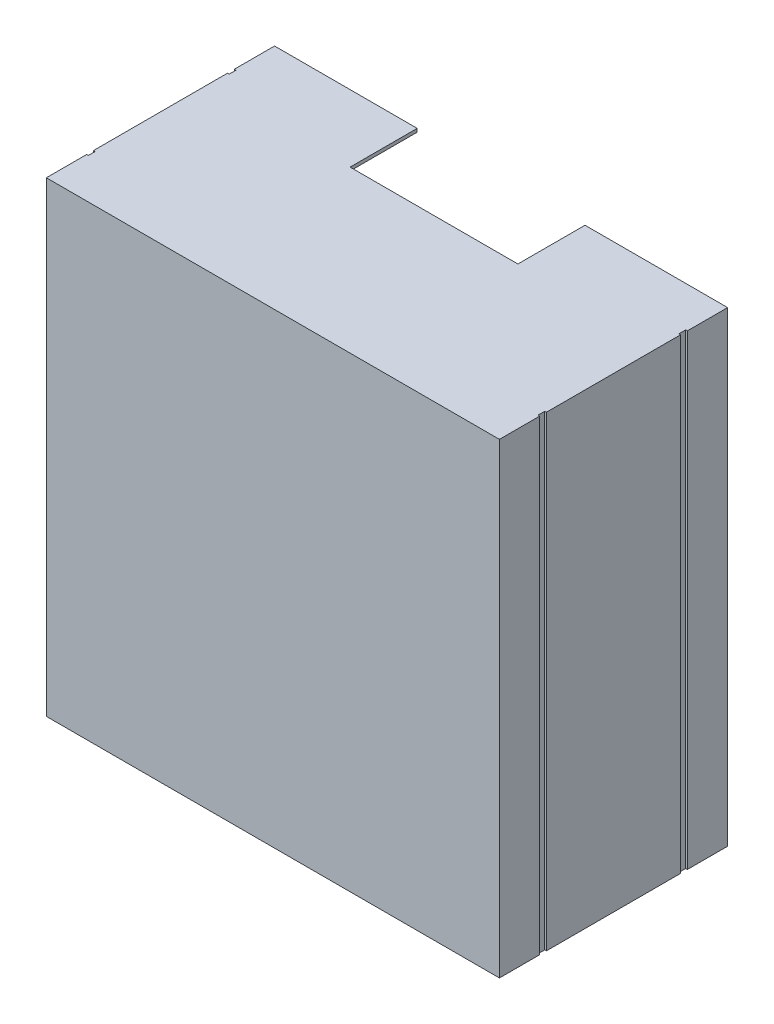
ISO-10303-21;
HEADER;
FILE_DESCRIPTION(('STEP AP214'),'2;1');
FILE_NAME('part.step','',(''),(''),'','','');
FILE_SCHEMA(('AUTOMOTIVE_DESIGN { 1 0 10303 214 1 1 1 1 }'));
ENDSEC;
DATA;
#1=APPLICATION_CONTEXT('core data for automotive mechanical design processes');
#2=APPLICATION_PROTOCOL_DEFINITION('international standard','automotive_design',2000,#1);
#3=PRODUCT_CONTEXT('',#1,'mechanical');
#4=PRODUCT('Part','Part','',(#3));
#5=PRODUCT_RELATED_PRODUCT_CATEGORY('part','',(#4));
#6=PRODUCT_DEFINITION_FORMATION('','',#4);
#7=PRODUCT_DEFINITION_CONTEXT('part definition',#1,'design');
#8=PRODUCT_DEFINITION('design','',#6,#7);
#9=PRODUCT_DEFINITION_SHAPE('','',#8);
#10=(LENGTH_UNIT() NAMED_UNIT(*) SI_UNIT(.MILLI.,.METRE.));
#11=(NAMED_UNIT(*) PLANE_ANGLE_UNIT() SI_UNIT($,.RADIAN.));
#12=(NAMED_UNIT(*) SI_UNIT($,.STERADIAN.) SOLID_ANGLE_UNIT());
#13=UNCERTAINTY_MEASURE_WITH_UNIT(LENGTH_MEASURE(1.E-05),#10,'distance_accuracy_value','');
#14=(GEOMETRIC_REPRESENTATION_CONTEXT(3) GLOBAL_UNCERTAINTY_ASSIGNED_CONTEXT((#13)) GLOBAL_UNIT_ASSIGNED_CONTEXT((#10,
#11,#12)) REPRESENTATION_CONTEXT('',''));
#15=CARTESIAN_POINT('',(0.,0.,0.));
#16=DIRECTION('',(0.,0.,1.));
#17=DIRECTION('',(1.,0.,0.));
#18=AXIS2_PLACEMENT_3D('',#15,#16,#17);
#19=CARTESIAN_POINT('',(-135.,278.,68.));
#20=DIRECTION('',(1.,0.,0.));
#21=DIRECTION('',(0.,0.,-1.));
#22=AXIS2_PLACEMENT_3D('',#19,#20,#21);
#23=PLANE('',#22);
#24=DIRECTION('',(0.,0.,1.));
#25=VECTOR('',#24,1.);
#26=CARTESIAN_POINT('',(-135.,0.,68.));
#27=LINE('',#26,#25);
#28=CARTESIAN_POINT('',(-135.,0.,-68.));
#29=VERTEX_POINT('',#28);
#30=CARTESIAN_POINT('',(-135.,0.,-43.9999999999999));
#31=VERTEX_POINT('',#30);
#32=EDGE_CURVE('E292',#29,#31,#27,.T.);
#33=ORIENTED_EDGE('',*,*,#32,.T.);
#34=DIRECTION('',(0.,-1.,0.));
#35=VECTOR('',#34,1.);
#36=CARTESIAN_POINT('',(-135.,278.001,-43.9999999999999));
#37=LINE('',#36,#35);
#38=CARTESIAN_POINT('',(-135.,278.,-43.9999999999999));
#39=VERTEX_POINT('',#38);
#40=EDGE_CURVE('E248',#39,#31,#37,.T.);
#41=ORIENTED_EDGE('',*,*,#40,.F.);
#42=DIRECTION('',(0.,0.,1.));
#43=VECTOR('',#42,1.);
#44=CARTESIAN_POINT('',(-135.,278.,68.));
#45=LINE('',#44,#43);
#46=CARTESIAN_POINT('',(-135.,278.,-68.));
#47=VERTEX_POINT('',#46);
#48=EDGE_CURVE('E266',#47,#39,#45,.T.);
#49=ORIENTED_EDGE('',*,*,#48,.F.);
#50=DIRECTION('',(0.,-1.,0.));
#51=VECTOR('',#50,1.);
#52=CARTESIAN_POINT('',(-135.,278.,-68.));
#53=LINE('',#52,#51);
#54=EDGE_CURVE('E291',#47,#29,#53,.T.);
#55=ORIENTED_EDGE('',*,*,#54,.T.);
#56=EDGE_LOOP('',(#33,#41,#49,#55));
#57=FACE_BOUND('',#56,.T.);
#58=ADVANCED_FACE('F47',(#57),#23,.F.);
#59=CARTESIAN_POINT('',(-135.,278.,44.));
#60=VERTEX_POINT('',#59);
#61=CARTESIAN_POINT('',(-135.,278.,68.));
#62=VERTEX_POINT('',#61);
#63=EDGE_CURVE('E267',#60,#62,#45,.T.);
#64=ORIENTED_EDGE('',*,*,#63,.F.);
#65=DIRECTION('',(0.,-1.,0.));
#66=VECTOR('',#65,1.);
#67=CARTESIAN_POINT('',(-135.,278.001,44.));
#68=LINE('',#67,#66);
#69=CARTESIAN_POINT('',(-135.,0.,44.));
#70=VERTEX_POINT('',#69);
#71=EDGE_CURVE('E380',#60,#70,#68,.T.);
#72=ORIENTED_EDGE('',*,*,#71,.T.);
#73=CARTESIAN_POINT('',(-135.,0.,68.));
#74=VERTEX_POINT('',#73);
#75=EDGE_CURVE('E298',#70,#74,#27,.T.);
#76=ORIENTED_EDGE('',*,*,#75,.T.);
#77=DIRECTION('',(0.,-1.,0.));
#78=VECTOR('',#77,1.);
#79=CARTESIAN_POINT('',(-135.,278.,68.));
#80=LINE('',#79,#78);
#81=EDGE_CURVE('E12',#62,#74,#80,.T.);
#82=ORIENTED_EDGE('',*,*,#81,.F.);
#83=EDGE_LOOP('',(#64,#72,#76,#82));
#84=FACE_BOUND('',#83,.T.);
#85=ADVANCED_FACE('F504',(#84),#23,.F.);
#86=CARTESIAN_POINT('',(135.,278.,68.));
#87=DIRECTION('',(-1.,0.,0.));
#88=DIRECTION('',(0.,0.,1.));
#89=AXIS2_PLACEMENT_3D('',#86,#87,#88);
#90=PLANE('',#89);
#91=DIRECTION('',(0.,0.,-1.));
#92=VECTOR('',#91,1.);
#93=CARTESIAN_POINT('',(135.,0.,68.));
#94=LINE('',#93,#92);
#95=CARTESIAN_POINT('',(135.,0.,68.));
#96=VERTEX_POINT('',#95);
#97=CARTESIAN_POINT('',(135.,0.,44.));
#98=VERTEX_POINT('',#97);
#99=EDGE_CURVE('E302',#96,#98,#94,.T.);
#100=ORIENTED_EDGE('',*,*,#99,.T.);
#101=DIRECTION('',(0.,-1.,0.));
#102=VECTOR('',#101,1.);
#103=CARTESIAN_POINT('',(135.,278.001,44.));
#104=LINE('',#103,#102);
#105=CARTESIAN_POINT('',(135.,278.,44.));
#106=VERTEX_POINT('',#105);
#107=EDGE_CURVE('E588',#106,#98,#104,.T.);
#108=ORIENTED_EDGE('',*,*,#107,.F.);
#109=DIRECTION('',(0.,0.,-1.));
#110=VECTOR('',#109,1.);
#111=CARTESIAN_POINT('',(135.,278.,68.));
#112=LINE('',#111,#110);
#113=CARTESIAN_POINT('',(135.,278.,68.));
#114=VERTEX_POINT('',#113);
#115=EDGE_CURVE('E281',#114,#106,#112,.T.);
#116=ORIENTED_EDGE('',*,*,#115,.F.);
#117=DIRECTION('',(0.,-1.,0.));
#118=VECTOR('',#117,1.);
#119=CARTESIAN_POINT('',(135.,278.,68.));
#120=LINE('',#119,#118);
#121=EDGE_CURVE('E56',#114,#96,#120,.T.);
#122=ORIENTED_EDGE('',*,*,#121,.T.);
#123=EDGE_LOOP('',(#100,#108,#116,#122));
#124=FACE_BOUND('',#123,.T.);
#125=ADVANCED_FACE('F321',(#124),#90,.F.);
#126=CARTESIAN_POINT('',(135.,278.,40.));
#127=VERTEX_POINT('',#126);
#128=CARTESIAN_POINT('',(135.,278.,-40.));
#129=VERTEX_POINT('',#128);
#130=EDGE_CURVE('E286',#127,#129,#112,.T.);
#131=ORIENTED_EDGE('',*,*,#130,.F.);
#132=DIRECTION('',(0.,-1.,0.));
#133=VECTOR('',#132,1.);
#134=CARTESIAN_POINT('',(135.,278.001,40.));
#135=LINE('',#134,#133);
#136=CARTESIAN_POINT('',(135.,0.,40.));
#137=VERTEX_POINT('',#136);
#138=EDGE_CURVE('E342',#127,#137,#135,.T.);
#139=ORIENTED_EDGE('',*,*,#138,.T.);
#140=CARTESIAN_POINT('',(135.,0.,-39.9999999999999));
#141=VERTEX_POINT('',#140);
#142=EDGE_CURVE('E306',#137,#141,#94,.T.);
#143=ORIENTED_EDGE('',*,*,#142,.T.);
#144=DIRECTION('',(0.,-1.,0.));
#145=VECTOR('',#144,1.);
#146=CARTESIAN_POINT('',(135.,278.001,-39.9999999999999));
#147=LINE('',#146,#145);
#148=EDGE_CURVE('E553',#129,#141,#147,.T.);
#149=ORIENTED_EDGE('',*,*,#148,.F.);
#150=EDGE_LOOP('',(#131,#139,#143,#149));
#151=FACE_BOUND('',#150,.T.);
#152=ADVANCED_FACE('F514',(#151),#90,.F.);
#153=CARTESIAN_POINT('',(-135.,278.,-39.9999999999999));
#154=VERTEX_POINT('',#153);
#155=CARTESIAN_POINT('',(-135.,278.,40.));
#156=VERTEX_POINT('',#155);
#157=EDGE_CURVE('E256',#154,#156,#45,.T.);
#158=ORIENTED_EDGE('',*,*,#157,.F.);
#159=DIRECTION('',(0.,-1.,0.));
#160=VECTOR('',#159,1.);
#161=CARTESIAN_POINT('',(-135.,278.001,-39.9999999999999));
#162=LINE('',#161,#160);
#163=CARTESIAN_POINT('',(-135.,0.,-39.9999999999999));
#164=VERTEX_POINT('',#163);
#165=EDGE_CURVE('E234',#154,#164,#162,.T.);
#166=ORIENTED_EDGE('',*,*,#165,.T.);
#167=CARTESIAN_POINT('',(-135.,0.,40.));
#168=VERTEX_POINT('',#167);
#169=EDGE_CURVE('E297',#164,#168,#27,.T.);
#170=ORIENTED_EDGE('',*,*,#169,.T.);
#171=DIRECTION('',(0.,-1.,0.));
#172=VECTOR('',#171,1.);
#173=CARTESIAN_POINT('',(-135.,278.001,40.));
#174=LINE('',#173,#172);
#175=EDGE_CURVE('E264',#156,#168,#174,.T.);
#176=ORIENTED_EDGE('',*,*,#175,.F.);
#177=EDGE_LOOP('',(#158,#166,#170,#176));
#178=FACE_BOUND('',#177,.T.);
#179=ADVANCED_FACE('F49',(#178),#23,.F.);
#180=CARTESIAN_POINT('',(135.,278.,68.));
#181=DIRECTION('',(0.,0.,-1.));
#182=DIRECTION('',(-1.,0.,0.));
#183=AXIS2_PLACEMENT_3D('',#180,#181,#182);
#184=PLANE('',#183);
#185=DIRECTION('',(1.,0.,0.));
#186=VECTOR('',#185,1.);
#187=CARTESIAN_POINT('',(135.,0.,68.));
#188=LINE('',#187,#186);
#189=EDGE_CURVE('E296',#74,#96,#188,.T.);
#190=ORIENTED_EDGE('',*,*,#189,.T.);
#191=ORIENTED_EDGE('',*,*,#121,.F.);
#192=DIRECTION('',(1.,0.,0.));
#193=VECTOR('',#192,1.);
#194=CARTESIAN_POINT('',(135.,278.,68.));
#195=LINE('',#194,#193);
#196=EDGE_CURVE('E272',#62,#114,#195,.T.);
#197=ORIENTED_EDGE('',*,*,#196,.F.);
#198=ORIENTED_EDGE('',*,*,#81,.T.);
#199=EDGE_LOOP('',(#190,#191,#197,#198));
#200=FACE_BOUND('',#199,.T.);
#201=ADVANCED_FACE('F505',(#200),#184,.F.);
#202=CARTESIAN_POINT('',(135.,278.,-43.9999999999999));
#203=VERTEX_POINT('',#202);
#204=CARTESIAN_POINT('',(135.,278.,-68.));
#205=VERTEX_POINT('',#204);
#206=EDGE_CURVE('E280',#203,#205,#112,.T.);
#207=ORIENTED_EDGE('',*,*,#206,.F.);
#208=DIRECTION('',(0.,-1.,0.));
#209=VECTOR('',#208,1.);
#210=CARTESIAN_POINT('',(135.,278.001,-43.9999999999999));
#211=LINE('',#210,#209);
#212=CARTESIAN_POINT('',(135.,0.,-43.9999999999999));
#213=VERTEX_POINT('',#212);
#214=EDGE_CURVE('E561',#203,#213,#211,.T.);
#215=ORIENTED_EDGE('',*,*,#214,.T.);
#216=CARTESIAN_POINT('',(135.,0.,-68.));
#217=VERTEX_POINT('',#216);
#218=EDGE_CURVE('E301',#213,#217,#94,.T.);
#219=ORIENTED_EDGE('',*,*,#218,.T.);
#220=DIRECTION('',(0.,-1.,0.));
#221=VECTOR('',#220,1.);
#222=CARTESIAN_POINT('',(135.,278.,-68.));
#223=LINE('',#222,#221);
#224=EDGE_CURVE('E312',#205,#217,#223,.T.);
#225=ORIENTED_EDGE('',*,*,#224,.F.);
#226=EDGE_LOOP('',(#207,#215,#219,#225));
#227=FACE_BOUND('',#226,.T.);
#228=ADVANCED_FACE('F507',(#227),#90,.F.);
#229=CARTESIAN_POINT('',(135.,278.,-68.));
#230=DIRECTION('',(0.,0.,1.));
#231=DIRECTION('',(1.,0.,0.));
#232=AXIS2_PLACEMENT_3D('',#229,#230,#231);
#233=PLANE('',#232);
#234=DIRECTION('',(-1.,0.,0.));
#235=VECTOR('',#234,1.);
#236=CARTESIAN_POINT('',(135.,278.,-68.));
#237=LINE('',#236,#235);
#238=CARTESIAN_POINT('',(-50.,278.,-68.));
#239=VERTEX_POINT('',#238);
#240=EDGE_CURVE('E285',#239,#47,#237,.T.);
#241=ORIENTED_EDGE('',*,*,#240,.F.);
#242=DIRECTION('',(0.,1.,0.));
#243=VECTOR('',#242,1.);
#244=CARTESIAN_POINT('',(-50.,-0.000999999999973245,-68.));
#245=LINE('',#244,#243);
#246=CARTESIAN_POINT('',(-50.,276.,-68.));
#247=VERTEX_POINT('',#246);
#248=EDGE_CURVE('E410',#247,#239,#245,.T.);
#249=ORIENTED_EDGE('',*,*,#248,.F.);
#250=DIRECTION('',(1.,0.,0.));
#251=VECTOR('',#250,1.);
#252=CARTESIAN_POINT('',(-133.,276.,-68.));
#253=LINE('',#252,#251);
#254=CARTESIAN_POINT('',(-133.,276.,-68.));
#255=VERTEX_POINT('',#254);
#256=EDGE_CURVE('E448',#255,#247,#253,.T.);
#257=ORIENTED_EDGE('',*,*,#256,.F.);
#258=DIRECTION('',(0.,1.,0.));
#259=VECTOR('',#258,1.);
#260=CARTESIAN_POINT('',(-133.,2.,-68.));
#261=LINE('',#260,#259);
#262=CARTESIAN_POINT('',(-133.,2.,-68.));
#263=VERTEX_POINT('',#262);
#264=EDGE_CURVE('E443',#263,#255,#261,.T.);
#265=ORIENTED_EDGE('',*,*,#264,.F.);
#266=DIRECTION('',(-1.,0.,0.));
#267=VECTOR('',#266,1.);
#268=CARTESIAN_POINT('',(133.,2.,-68.));
#269=LINE('',#268,#267);
#270=CARTESIAN_POINT('',(133.,2.,-68.));
#271=VERTEX_POINT('',#270);
#272=EDGE_CURVE('E439',#271,#263,#269,.T.);
#273=ORIENTED_EDGE('',*,*,#272,.F.);
#274=DIRECTION('',(0.,-1.,0.));
#275=VECTOR('',#274,1.);
#276=CARTESIAN_POINT('',(133.,276.,-68.));
#277=LINE('',#276,#275);
#278=CARTESIAN_POINT('',(133.,276.,-68.));
#279=VERTEX_POINT('',#278);
#280=EDGE_CURVE('E426',#279,#271,#277,.T.);
#281=ORIENTED_EDGE('',*,*,#280,.F.);
#282=CARTESIAN_POINT('',(50.,276.,-68.));
#283=VERTEX_POINT('',#282);
#284=EDGE_CURVE('E447',#283,#279,#253,.T.);
#285=ORIENTED_EDGE('',*,*,#284,.F.);
#286=DIRECTION('',(0.,1.,0.));
#287=VECTOR('',#286,1.);
#288=CARTESIAN_POINT('',(50.,-0.000999999999973245,-68.));
#289=LINE('',#288,#287);
#290=CARTESIAN_POINT('',(50.,278.,-68.));
#291=VERTEX_POINT('',#290);
#292=EDGE_CURVE('E414',#283,#291,#289,.T.);
#293=ORIENTED_EDGE('',*,*,#292,.T.);
#294=EDGE_CURVE('E287',#205,#291,#237,.T.);
#295=ORIENTED_EDGE('',*,*,#294,.F.);
#296=ORIENTED_EDGE('',*,*,#224,.T.);
#297=DIRECTION('',(-1.,0.,0.));
#298=VECTOR('',#297,1.);
#299=CARTESIAN_POINT('',(135.,0.,-68.));
#300=LINE('',#299,#298);
#301=EDGE_CURVE('E273',#217,#29,#300,.T.);
#302=ORIENTED_EDGE('',*,*,#301,.T.);
#303=ORIENTED_EDGE('',*,*,#54,.F.);
#304=EDGE_LOOP('',(#241,#249,#257,#265,#273,#281,#285,#293,#295,#296,#302,#303));
#305=FACE_BOUND('',#304,.T.);
#306=ADVANCED_FACE('F475',(#305),#233,.F.);
#307=CARTESIAN_POINT('',(0.,278.,0.));
#308=DIRECTION('',(0.,1.,0.));
#309=DIRECTION('',(0.,0.,1.));
#310=AXIS2_PLACEMENT_3D('',#307,#308,#309);
#311=PLANE('',#310);
#312=DIRECTION('',(-1.,0.,0.));
#313=VECTOR('',#312,1.);
#314=CARTESIAN_POINT('',(135.,278.,44.));
#315=LINE('',#314,#313);
#316=CARTESIAN_POINT('',(134.,278.,44.));
#317=VERTEX_POINT('',#316);
#318=EDGE_CURVE('E350',#106,#317,#315,.T.);
#319=ORIENTED_EDGE('',*,*,#318,.T.);
#320=DIRECTION('',(0.,0.,-1.));
#321=VECTOR('',#320,1.);
#322=CARTESIAN_POINT('',(134.,278.,44.));
#323=LINE('',#322,#321);
#324=CARTESIAN_POINT('',(134.,278.,40.));
#325=VERTEX_POINT('',#324);
#326=EDGE_CURVE('E353',#317,#325,#323,.T.);
#327=ORIENTED_EDGE('',*,*,#326,.T.);
#328=DIRECTION('',(1.,0.,0.));
#329=VECTOR('',#328,1.);
#330=CARTESIAN_POINT('',(134.,278.,40.));
#331=LINE('',#330,#329);
#332=EDGE_CURVE('E582',#325,#127,#331,.T.);
#333=ORIENTED_EDGE('',*,*,#332,.T.);
#334=ORIENTED_EDGE('',*,*,#130,.T.);
#335=DIRECTION('',(-1.,0.,0.));
#336=VECTOR('',#335,1.);
#337=CARTESIAN_POINT('',(134.,278.,-39.9999999999999));
#338=LINE('',#337,#336);
#339=CARTESIAN_POINT('',(134.,278.,-39.9999999999999));
#340=VERTEX_POINT('',#339);
#341=EDGE_CURVE('E575',#129,#340,#338,.T.);
#342=ORIENTED_EDGE('',*,*,#341,.T.);
#343=DIRECTION('',(0.,0.,-1.));
#344=VECTOR('',#343,1.);
#345=CARTESIAN_POINT('',(134.,278.,-43.9999999999999));
#346=LINE('',#345,#344);
#347=CARTESIAN_POINT('',(134.,278.,-43.9999999999999));
#348=VERTEX_POINT('',#347);
#349=EDGE_CURVE('E357',#340,#348,#346,.T.);
#350=ORIENTED_EDGE('',*,*,#349,.T.);
#351=DIRECTION('',(1.,0.,0.));
#352=VECTOR('',#351,1.);
#353=CARTESIAN_POINT('',(135.,278.,-43.9999999999999));
#354=LINE('',#353,#352);
#355=EDGE_CURVE('E261',#348,#203,#354,.T.);
#356=ORIENTED_EDGE('',*,*,#355,.T.);
#357=ORIENTED_EDGE('',*,*,#206,.T.);
#358=ORIENTED_EDGE('',*,*,#294,.T.);
#359=DIRECTION('',(0.,0.,-1.));
#360=VECTOR('',#359,1.);
#361=CARTESIAN_POINT('',(50.,278.,-68.));
#362=LINE('',#361,#360);
#363=CARTESIAN_POINT('',(50.,278.,-28.));
#364=VERTEX_POINT('',#363);
#365=EDGE_CURVE('E406',#364,#291,#362,.T.);
#366=ORIENTED_EDGE('',*,*,#365,.F.);
#367=DIRECTION('',(1.,0.,0.));
#368=VECTOR('',#367,1.);
#369=CARTESIAN_POINT('',(-50.,278.,-28.));
#370=LINE('',#369,#368);
#371=CARTESIAN_POINT('',(-50.,278.,-28.));
#372=VERTEX_POINT('',#371);
#373=EDGE_CURVE('E402',#372,#364,#370,.T.);
#374=ORIENTED_EDGE('',*,*,#373,.F.);
#375=DIRECTION('',(0.,0.,1.));
#376=VECTOR('',#375,1.);
#377=CARTESIAN_POINT('',(-50.,278.,-68.));
#378=LINE('',#377,#376);
#379=EDGE_CURVE('E398',#239,#372,#378,.T.);
#380=ORIENTED_EDGE('',*,*,#379,.F.);
#381=ORIENTED_EDGE('',*,*,#240,.T.);
#382=ORIENTED_EDGE('',*,*,#48,.T.);
#383=DIRECTION('',(1.,0.,0.));
#384=VECTOR('',#383,1.);
#385=CARTESIAN_POINT('',(-135.,278.,-43.9999999999999));
#386=LINE('',#385,#384);
#387=CARTESIAN_POINT('',(-134.,278.,-43.9999999999999));
#388=VERTEX_POINT('',#387);
#389=EDGE_CURVE('E545',#39,#388,#386,.T.);
#390=ORIENTED_EDGE('',*,*,#389,.T.);
#391=DIRECTION('',(0.,0.,1.));
#392=VECTOR('',#391,1.);
#393=CARTESIAN_POINT('',(-134.,278.,-43.9999999999999));
#394=LINE('',#393,#392);
#395=CARTESIAN_POINT('',(-134.,278.,-39.9999999999999));
#396=VERTEX_POINT('',#395);
#397=EDGE_CURVE('E258',#388,#396,#394,.T.);
#398=ORIENTED_EDGE('',*,*,#397,.T.);
#399=DIRECTION('',(-1.,0.,0.));
#400=VECTOR('',#399,1.);
#401=CARTESIAN_POINT('',(-134.,278.,-39.9999999999999));
#402=LINE('',#401,#400);
#403=EDGE_CURVE('E238',#396,#154,#402,.T.);
#404=ORIENTED_EDGE('',*,*,#403,.T.);
#405=ORIENTED_EDGE('',*,*,#157,.T.);
#406=DIRECTION('',(1.,0.,0.));
#407=VECTOR('',#406,1.);
#408=CARTESIAN_POINT('',(-134.,278.,40.));
#409=LINE('',#408,#407);
#410=CARTESIAN_POINT('',(-134.,278.,40.));
#411=VERTEX_POINT('',#410);
#412=EDGE_CURVE('E358',#156,#411,#409,.T.);
#413=ORIENTED_EDGE('',*,*,#412,.T.);
#414=DIRECTION('',(0.,0.,1.));
#415=VECTOR('',#414,1.);
#416=CARTESIAN_POINT('',(-134.,278.,44.));
#417=LINE('',#416,#415);
#418=CARTESIAN_POINT('',(-134.,278.,44.));
#419=VERTEX_POINT('',#418);
#420=EDGE_CURVE('E361',#411,#419,#417,.T.);
#421=ORIENTED_EDGE('',*,*,#420,.T.);
#422=DIRECTION('',(-1.,0.,0.));
#423=VECTOR('',#422,1.);
#424=CARTESIAN_POINT('',(-135.,278.,44.));
#425=LINE('',#424,#423);
#426=EDGE_CURVE('E365',#419,#60,#425,.T.);
#427=ORIENTED_EDGE('',*,*,#426,.T.);
#428=ORIENTED_EDGE('',*,*,#63,.T.);
#429=ORIENTED_EDGE('',*,*,#196,.T.);
#430=ORIENTED_EDGE('',*,*,#115,.T.);
#431=EDGE_LOOP('',(#319,#327,#333,#334,#342,#350,#356,#357,#358,#366,#374,#380,#381,#382,#390,
#398,#404,#405,#413,#421,#427,#428,#429,#430));
#432=FACE_BOUND('',#431,.T.);
#433=ADVANCED_FACE('F254',(#432),#311,.T.);
#434=CARTESIAN_POINT('',(0.,0.,0.));
#435=DIRECTION('',(0.,1.,0.));
#436=DIRECTION('',(0.,0.,1.));
#437=AXIS2_PLACEMENT_3D('',#434,#435,#436);
#438=PLANE('',#437);
#439=DIRECTION('',(0.,0.,-1.));
#440=VECTOR('',#439,1.);
#441=CARTESIAN_POINT('',(134.,0.,44.));
#442=LINE('',#441,#440);
#443=CARTESIAN_POINT('',(134.,0.,44.));
#444=VERTEX_POINT('',#443);
#445=CARTESIAN_POINT('',(134.,0.,40.));
#446=VERTEX_POINT('',#445);
#447=EDGE_CURVE('E63',#444,#446,#442,.T.);
#448=ORIENTED_EDGE('',*,*,#447,.F.);
#449=DIRECTION('',(-1.,0.,0.));
#450=VECTOR('',#449,1.);
#451=CARTESIAN_POINT('',(135.,0.,44.));
#452=LINE('',#451,#450);
#453=EDGE_CURVE('E331',#98,#444,#452,.T.);
#454=ORIENTED_EDGE('',*,*,#453,.F.);
#455=ORIENTED_EDGE('',*,*,#99,.F.);
#456=ORIENTED_EDGE('',*,*,#189,.F.);
#457=ORIENTED_EDGE('',*,*,#75,.F.);
#458=DIRECTION('',(-1.,0.,0.));
#459=VECTOR('',#458,1.);
#460=CARTESIAN_POINT('',(-135.,0.,44.));
#461=LINE('',#460,#459);
#462=CARTESIAN_POINT('',(-134.,0.,44.));
#463=VERTEX_POINT('',#462);
#464=EDGE_CURVE('E369',#463,#70,#461,.T.);
#465=ORIENTED_EDGE('',*,*,#464,.F.);
#466=DIRECTION('',(0.,0.,1.));
#467=VECTOR('',#466,1.);
#468=CARTESIAN_POINT('',(-134.,0.,44.));
#469=LINE('',#468,#467);
#470=CARTESIAN_POINT('',(-134.,0.,40.));
#471=VERTEX_POINT('',#470);
#472=EDGE_CURVE('E376',#471,#463,#469,.T.);
#473=ORIENTED_EDGE('',*,*,#472,.F.);
#474=DIRECTION('',(1.,0.,0.));
#475=VECTOR('',#474,1.);
#476=CARTESIAN_POINT('',(-134.,0.,40.));
#477=LINE('',#476,#475);
#478=EDGE_CURVE('E372',#168,#471,#477,.T.);
#479=ORIENTED_EDGE('',*,*,#478,.F.);
#480=ORIENTED_EDGE('',*,*,#169,.F.);
#481=DIRECTION('',(-1.,0.,0.));
#482=VECTOR('',#481,1.);
#483=CARTESIAN_POINT('',(-134.,0.,-39.9999999999999));
#484=LINE('',#483,#482);
#485=CARTESIAN_POINT('',(-134.,0.,-39.9999999999999));
#486=VERTEX_POINT('',#485);
#487=EDGE_CURVE('E241',#486,#164,#484,.T.);
#488=ORIENTED_EDGE('',*,*,#487,.F.);
#489=DIRECTION('',(0.,0.,1.));
#490=VECTOR('',#489,1.);
#491=CARTESIAN_POINT('',(-134.,0.,-43.9999999999999));
#492=LINE('',#491,#490);
#493=CARTESIAN_POINT('',(-134.,0.,-43.9999999999999));
#494=VERTEX_POINT('',#493);
#495=EDGE_CURVE('E531',#494,#486,#492,.T.);
#496=ORIENTED_EDGE('',*,*,#495,.F.);
#497=DIRECTION('',(1.,0.,0.));
#498=VECTOR('',#497,1.);
#499=CARTESIAN_POINT('',(-135.,0.,-43.9999999999999));
#500=LINE('',#499,#498);
#501=EDGE_CURVE('E530',#31,#494,#500,.T.);
#502=ORIENTED_EDGE('',*,*,#501,.F.);
#503=ORIENTED_EDGE('',*,*,#32,.F.);
#504=ORIENTED_EDGE('',*,*,#301,.F.);
#505=ORIENTED_EDGE('',*,*,#218,.F.);
#506=DIRECTION('',(1.,0.,0.));
#507=VECTOR('',#506,1.);
#508=CARTESIAN_POINT('',(135.,0.,-43.9999999999999));
#509=LINE('',#508,#507);
#510=CARTESIAN_POINT('',(134.,0.,-43.9999999999999));
#511=VERTEX_POINT('',#510);
#512=EDGE_CURVE('E557',#511,#213,#509,.T.);
#513=ORIENTED_EDGE('',*,*,#512,.F.);
#514=DIRECTION('',(0.,0.,-1.));
#515=VECTOR('',#514,1.);
#516=CARTESIAN_POINT('',(134.,0.,-43.9999999999999));
#517=LINE('',#516,#515);
#518=CARTESIAN_POINT('',(134.,0.,-39.9999999999999));
#519=VERTEX_POINT('',#518);
#520=EDGE_CURVE('E569',#519,#511,#517,.T.);
#521=ORIENTED_EDGE('',*,*,#520,.F.);
#522=DIRECTION('',(-1.,0.,0.));
#523=VECTOR('',#522,1.);
#524=CARTESIAN_POINT('',(134.,0.,-39.9999999999999));
#525=LINE('',#524,#523);
#526=EDGE_CURVE('E71',#141,#519,#525,.T.);
#527=ORIENTED_EDGE('',*,*,#526,.F.);
#528=ORIENTED_EDGE('',*,*,#142,.F.);
#529=DIRECTION('',(1.,0.,0.));
#530=VECTOR('',#529,1.);
#531=CARTESIAN_POINT('',(134.,0.,40.));
#532=LINE('',#531,#530);
#533=EDGE_CURVE('E336',#446,#137,#532,.T.);
#534=ORIENTED_EDGE('',*,*,#533,.F.);
#535=EDGE_LOOP('',(#448,#454,#455,#456,#457,#465,#473,#479,#480,#488,#496,#502,#503,#504,#505,
#513,#521,#527,#528,#534));
#536=FACE_BOUND('',#535,.T.);
#537=ADVANCED_FACE('F328',(#536),#438,.F.);
#538=CARTESIAN_POINT('',(133.,276.,449.879562165875));
#539=DIRECTION('',(1.,0.,0.));
#540=DIRECTION('',(0.,0.,-1.));
#541=AXIS2_PLACEMENT_3D('',#538,#539,#540);
#542=PLANE('',#541);
#543=DIRECTION('',(0.,1.,0.));
#544=VECTOR('',#543,1.);
#545=CARTESIAN_POINT('',(133.,276.,66.));
#546=LINE('',#545,#544);
#547=CARTESIAN_POINT('',(133.,2.,66.));
#548=VERTEX_POINT('',#547);
#549=CARTESIAN_POINT('',(133.,276.,66.));
#550=VERTEX_POINT('',#549);
#551=EDGE_CURVE('E434',#548,#550,#546,.T.);
#552=ORIENTED_EDGE('',*,*,#551,.T.);
#553=DIRECTION('',(0.,0.,-1.));
#554=VECTOR('',#553,1.);
#555=CARTESIAN_POINT('',(133.,276.,449.879562165875));
#556=LINE('',#555,#554);
#557=EDGE_CURVE('E431',#550,#279,#556,.T.);
#558=ORIENTED_EDGE('',*,*,#557,.T.);
#559=ORIENTED_EDGE('',*,*,#280,.T.);
#560=DIRECTION('',(0.,0.,-1.));
#561=VECTOR('',#560,1.);
#562=CARTESIAN_POINT('',(133.,2.,449.879562165875));
#563=LINE('',#562,#561);
#564=EDGE_CURVE('E452',#548,#271,#563,.T.);
#565=ORIENTED_EDGE('',*,*,#564,.F.);
#566=EDGE_LOOP('',(#552,#558,#559,#565));
#567=FACE_BOUND('',#566,.T.);
#568=ADVANCED_FACE('F669',(#567),#542,.F.);
#569=CARTESIAN_POINT('',(-133.,276.,449.879562165875));
#570=DIRECTION('',(0.,1.,0.));
#571=DIRECTION('',(0.,0.,1.));
#572=AXIS2_PLACEMENT_3D('',#569,#570,#571);
#573=PLANE('',#572);
#574=ORIENTED_EDGE('',*,*,#256,.T.);
#575=DIRECTION('',(0.,0.,-1.));
#576=VECTOR('',#575,1.);
#577=CARTESIAN_POINT('',(-50.,276.,-68.));
#578=LINE('',#577,#576);
#579=CARTESIAN_POINT('',(-50.,276.,-28.));
#580=VERTEX_POINT('',#579);
#581=EDGE_CURVE('E395',#580,#247,#578,.T.);
#582=ORIENTED_EDGE('',*,*,#581,.F.);
#583=DIRECTION('',(-1.,0.,0.));
#584=VECTOR('',#583,1.);
#585=CARTESIAN_POINT('',(-50.,276.,-28.));
#586=LINE('',#585,#584);
#587=CARTESIAN_POINT('',(50.,276.,-28.));
#588=VERTEX_POINT('',#587);
#589=EDGE_CURVE('E413',#588,#580,#586,.T.);
#590=ORIENTED_EDGE('',*,*,#589,.F.);
#591=DIRECTION('',(0.,0.,1.));
#592=VECTOR('',#591,1.);
#593=CARTESIAN_POINT('',(50.,276.,-68.));
#594=LINE('',#593,#592);
#595=EDGE_CURVE('E384',#283,#588,#594,.T.);
#596=ORIENTED_EDGE('',*,*,#595,.F.);
#597=ORIENTED_EDGE('',*,*,#284,.T.);
#598=ORIENTED_EDGE('',*,*,#557,.F.);
#599=DIRECTION('',(-1.,0.,0.));
#600=VECTOR('',#599,1.);
#601=CARTESIAN_POINT('',(-133.,276.,66.));
#602=LINE('',#601,#600);
#603=CARTESIAN_POINT('',(-133.,276.,66.));
#604=VERTEX_POINT('',#603);
#605=EDGE_CURVE('E430',#550,#604,#602,.T.);
#606=ORIENTED_EDGE('',*,*,#605,.T.);
#607=DIRECTION('',(0.,0.,-1.));
#608=VECTOR('',#607,1.);
#609=CARTESIAN_POINT('',(-133.,276.,449.879562165875));
#610=LINE('',#609,#608);
#611=EDGE_CURVE('E456',#604,#255,#610,.T.);
#612=ORIENTED_EDGE('',*,*,#611,.T.);
#613=EDGE_LOOP('',(#574,#582,#590,#596,#597,#598,#606,#612));
#614=FACE_BOUND('',#613,.T.);
#615=ADVANCED_FACE('F612',(#614),#573,.F.);
#616=CARTESIAN_POINT('',(-133.,2.,449.879562165875));
#617=DIRECTION('',(-1.,0.,0.));
#618=DIRECTION('',(0.,0.,1.));
#619=AXIS2_PLACEMENT_3D('',#616,#617,#618);
#620=PLANE('',#619);
#621=DIRECTION('',(0.,-1.,0.));
#622=VECTOR('',#621,1.);
#623=CARTESIAN_POINT('',(-133.,2.,66.));
#624=LINE('',#623,#622);
#625=CARTESIAN_POINT('',(-133.,2.,66.));
#626=VERTEX_POINT('',#625);
#627=EDGE_CURVE('E427',#604,#626,#624,.T.);
#628=ORIENTED_EDGE('',*,*,#627,.T.);
#629=DIRECTION('',(0.,0.,-1.));
#630=VECTOR('',#629,1.);
#631=CARTESIAN_POINT('',(-133.,2.,449.879562165875));
#632=LINE('',#631,#630);
#633=EDGE_CURVE('E459',#626,#263,#632,.T.);
#634=ORIENTED_EDGE('',*,*,#633,.T.);
#635=ORIENTED_EDGE('',*,*,#264,.T.);
#636=ORIENTED_EDGE('',*,*,#611,.F.);
#637=EDGE_LOOP('',(#628,#634,#635,#636));
#638=FACE_BOUND('',#637,.T.);
#639=ADVANCED_FACE('F481',(#638),#620,.F.);
#640=CARTESIAN_POINT('',(133.,2.,449.879562165875));
#641=DIRECTION('',(0.,-1.,0.));
#642=DIRECTION('',(0.,0.,-1.));
#643=AXIS2_PLACEMENT_3D('',#640,#641,#642);
#644=PLANE('',#643);
#645=DIRECTION('',(1.,0.,0.));
#646=VECTOR('',#645,1.);
#647=CARTESIAN_POINT('',(133.,2.,66.));
#648=LINE('',#647,#646);
#649=EDGE_CURVE('E276',#626,#548,#648,.T.);
#650=ORIENTED_EDGE('',*,*,#649,.T.);
#651=ORIENTED_EDGE('',*,*,#564,.T.);
#652=ORIENTED_EDGE('',*,*,#272,.T.);
#653=ORIENTED_EDGE('',*,*,#633,.F.);
#654=EDGE_LOOP('',(#650,#651,#652,#653));
#655=FACE_BOUND('',#654,.T.);
#656=ADVANCED_FACE('F466',(#655),#644,.F.);
#657=CARTESIAN_POINT('',(135.,278.,66.));
#658=DIRECTION('',(0.,0.,-1.));
#659=DIRECTION('',(-1.,0.,0.));
#660=AXIS2_PLACEMENT_3D('',#657,#658,#659);
#661=PLANE('',#660);
#662=ORIENTED_EDGE('',*,*,#551,.F.);
#663=ORIENTED_EDGE('',*,*,#649,.F.);
#664=ORIENTED_EDGE('',*,*,#627,.F.);
#665=ORIENTED_EDGE('',*,*,#605,.F.);
#666=EDGE_LOOP('',(#662,#663,#664,#665));
#667=FACE_BOUND('',#666,.T.);
#668=ADVANCED_FACE('F484',(#667),#661,.T.);
#669=CARTESIAN_POINT('',(-50.,-0.000999999999973245,-68.));
#670=DIRECTION('',(-1.,0.,0.));
#671=DIRECTION('',(0.,0.,1.));
#672=AXIS2_PLACEMENT_3D('',#669,#670,#671);
#673=PLANE('',#672);
#674=ORIENTED_EDGE('',*,*,#581,.T.);
#675=ORIENTED_EDGE('',*,*,#248,.T.);
#676=ORIENTED_EDGE('',*,*,#379,.T.);
#677=DIRECTION('',(0.,1.,0.));
#678=VECTOR('',#677,1.);
#679=CARTESIAN_POINT('',(-50.,-0.000999999999973245,-28.));
#680=LINE('',#679,#678);
#681=EDGE_CURVE('E409',#580,#372,#680,.T.);
#682=ORIENTED_EDGE('',*,*,#681,.F.);
#683=EDGE_LOOP('',(#674,#675,#676,#682));
#684=FACE_BOUND('',#683,.T.);
#685=ADVANCED_FACE('F661',(#684),#673,.F.);
#686=CARTESIAN_POINT('',(50.,-0.000999999999973245,-68.));
#687=DIRECTION('',(1.,0.,0.));
#688=DIRECTION('',(0.,0.,-1.));
#689=AXIS2_PLACEMENT_3D('',#686,#687,#688);
#690=PLANE('',#689);
#691=ORIENTED_EDGE('',*,*,#595,.T.);
#692=DIRECTION('',(0.,1.,0.));
#693=VECTOR('',#692,1.);
#694=CARTESIAN_POINT('',(50.,-0.000999999999973245,-28.));
#695=LINE('',#694,#693);
#696=EDGE_CURVE('E418',#588,#364,#695,.T.);
#697=ORIENTED_EDGE('',*,*,#696,.T.);
#698=ORIENTED_EDGE('',*,*,#365,.T.);
#699=ORIENTED_EDGE('',*,*,#292,.F.);
#700=EDGE_LOOP('',(#691,#697,#698,#699));
#701=FACE_BOUND('',#700,.T.);
#702=ADVANCED_FACE('F608',(#701),#690,.F.);
#703=CARTESIAN_POINT('',(-50.,-0.000999999999973245,-28.));
#704=DIRECTION('',(0.,0.,1.));
#705=DIRECTION('',(1.,0.,0.));
#706=AXIS2_PLACEMENT_3D('',#703,#704,#705);
#707=PLANE('',#706);
#708=ORIENTED_EDGE('',*,*,#589,.T.);
#709=ORIENTED_EDGE('',*,*,#681,.T.);
#710=ORIENTED_EDGE('',*,*,#373,.T.);
#711=ORIENTED_EDGE('',*,*,#696,.F.);
#712=EDGE_LOOP('',(#708,#709,#710,#711));
#713=FACE_BOUND('',#712,.T.);
#714=ADVANCED_FACE('F616',(#713),#707,.F.);
#715=CARTESIAN_POINT('',(-135.,278.001,44.));
#716=DIRECTION('',(0.,0.,1.));
#717=DIRECTION('',(1.,0.,0.));
#718=AXIS2_PLACEMENT_3D('',#715,#716,#717);
#719=PLANE('',#718);
#720=DIRECTION('',(0.,-1.,0.));
#721=VECTOR('',#720,1.);
#722=CARTESIAN_POINT('',(-134.,278.001,44.));
#723=LINE('',#722,#721);
#724=EDGE_CURVE('E381',#419,#463,#723,.T.);
#725=ORIENTED_EDGE('',*,*,#724,.T.);
#726=ORIENTED_EDGE('',*,*,#464,.T.);
#727=ORIENTED_EDGE('',*,*,#71,.F.);
#728=ORIENTED_EDGE('',*,*,#426,.F.);
#729=EDGE_LOOP('',(#725,#726,#727,#728));
#730=FACE_BOUND('',#729,.T.);
#731=ADVANCED_FACE('F503',(#730),#719,.F.);
#732=CARTESIAN_POINT('',(-134.,278.001,44.));
#733=DIRECTION('',(1.,0.,0.));
#734=DIRECTION('',(0.,0.,-1.));
#735=AXIS2_PLACEMENT_3D('',#732,#733,#734);
#736=PLANE('',#735);
#737=DIRECTION('',(0.,-1.,0.));
#738=VECTOR('',#737,1.);
#739=CARTESIAN_POINT('',(-134.,278.001,40.));
#740=LINE('',#739,#738);
#741=EDGE_CURVE('E385',#411,#471,#740,.T.);
#742=ORIENTED_EDGE('',*,*,#741,.T.);
#743=ORIENTED_EDGE('',*,*,#472,.T.);
#744=ORIENTED_EDGE('',*,*,#724,.F.);
#745=ORIENTED_EDGE('',*,*,#420,.F.);
#746=EDGE_LOOP('',(#742,#743,#744,#745));
#747=FACE_BOUND('',#746,.T.);
#748=ADVANCED_FACE('F501',(#747),#736,.F.);
#749=CARTESIAN_POINT('',(-134.,278.001,40.));
#750=DIRECTION('',(0.,0.,-1.));
#751=DIRECTION('',(-1.,0.,0.));
#752=AXIS2_PLACEMENT_3D('',#749,#750,#751);
#753=PLANE('',#752);
#754=ORIENTED_EDGE('',*,*,#175,.T.);
#755=ORIENTED_EDGE('',*,*,#478,.T.);
#756=ORIENTED_EDGE('',*,*,#741,.F.);
#757=ORIENTED_EDGE('',*,*,#412,.F.);
#758=EDGE_LOOP('',(#754,#755,#756,#757));
#759=FACE_BOUND('',#758,.T.);
#760=ADVANCED_FACE('F497',(#759),#753,.F.);
#761=CARTESIAN_POINT('',(-134.,278.001,-43.9999999999999));
#762=DIRECTION('',(1.,0.,0.));
#763=DIRECTION('',(0.,0.,-1.));
#764=AXIS2_PLACEMENT_3D('',#761,#762,#763);
#765=PLANE('',#764);
#766=DIRECTION('',(0.,-1.,0.));
#767=VECTOR('',#766,1.);
#768=CARTESIAN_POINT('',(-134.,278.001,-43.9999999999999));
#769=LINE('',#768,#767);
#770=EDGE_CURVE('E260',#388,#494,#769,.T.);
#771=ORIENTED_EDGE('',*,*,#770,.T.);
#772=ORIENTED_EDGE('',*,*,#495,.T.);
#773=DIRECTION('',(0.,-1.,0.));
#774=VECTOR('',#773,1.);
#775=CARTESIAN_POINT('',(-134.,278.001,-39.9999999999999));
#776=LINE('',#775,#774);
#777=EDGE_CURVE('E247',#396,#486,#776,.T.);
#778=ORIENTED_EDGE('',*,*,#777,.F.);
#779=ORIENTED_EDGE('',*,*,#397,.F.);
#780=EDGE_LOOP('',(#771,#772,#778,#779));
#781=FACE_BOUND('',#780,.T.);
#782=ADVANCED_FACE('F625',(#781),#765,.F.);
#783=CARTESIAN_POINT('',(-135.,278.001,-43.9999999999999));
#784=DIRECTION('',(0.,0.,-1.));
#785=DIRECTION('',(-1.,0.,0.));
#786=AXIS2_PLACEMENT_3D('',#783,#784,#785);
#787=PLANE('',#786);
#788=ORIENTED_EDGE('',*,*,#40,.T.);
#789=ORIENTED_EDGE('',*,*,#501,.T.);
#790=ORIENTED_EDGE('',*,*,#770,.F.);
#791=ORIENTED_EDGE('',*,*,#389,.F.);
#792=EDGE_LOOP('',(#788,#789,#790,#791));
#793=FACE_BOUND('',#792,.T.);
#794=ADVANCED_FACE('F621',(#793),#787,.F.);
#795=CARTESIAN_POINT('',(-134.,278.001,-39.9999999999999));
#796=DIRECTION('',(0.,0.,1.));
#797=DIRECTION('',(1.,0.,0.));
#798=AXIS2_PLACEMENT_3D('',#795,#796,#797);
#799=PLANE('',#798);
#800=ORIENTED_EDGE('',*,*,#777,.T.);
#801=ORIENTED_EDGE('',*,*,#487,.T.);
#802=ORIENTED_EDGE('',*,*,#165,.F.);
#803=ORIENTED_EDGE('',*,*,#403,.F.);
#804=EDGE_LOOP('',(#800,#801,#802,#803));
#805=FACE_BOUND('',#804,.T.);
#806=ADVANCED_FACE('F237',(#805),#799,.F.);
#807=CARTESIAN_POINT('',(134.,278.001,-39.9999999999999));
#808=DIRECTION('',(0.,0.,1.));
#809=DIRECTION('',(1.,0.,0.));
#810=AXIS2_PLACEMENT_3D('',#807,#808,#809);
#811=PLANE('',#810);
#812=ORIENTED_EDGE('',*,*,#148,.T.);
#813=ORIENTED_EDGE('',*,*,#526,.T.);
#814=DIRECTION('',(0.,-1.,0.));
#815=VECTOR('',#814,1.);
#816=CARTESIAN_POINT('',(134.,278.001,-39.9999999999999));
#817=LINE('',#816,#815);
#818=EDGE_CURVE('E554',#340,#519,#817,.T.);
#819=ORIENTED_EDGE('',*,*,#818,.F.);
#820=ORIENTED_EDGE('',*,*,#341,.F.);
#821=EDGE_LOOP('',(#812,#813,#819,#820));
#822=FACE_BOUND('',#821,.T.);
#823=ADVANCED_FACE('F636',(#822),#811,.F.);
#824=CARTESIAN_POINT('',(135.,278.001,-43.9999999999999));
#825=DIRECTION('',(0.,0.,-1.));
#826=DIRECTION('',(-1.,0.,0.));
#827=AXIS2_PLACEMENT_3D('',#824,#825,#826);
#828=PLANE('',#827);
#829=DIRECTION('',(0.,-1.,0.));
#830=VECTOR('',#829,1.);
#831=CARTESIAN_POINT('',(134.,278.001,-43.9999999999999));
#832=LINE('',#831,#830);
#833=EDGE_CURVE('E558',#348,#511,#832,.T.);
#834=ORIENTED_EDGE('',*,*,#833,.T.);
#835=ORIENTED_EDGE('',*,*,#512,.T.);
#836=ORIENTED_EDGE('',*,*,#214,.F.);
#837=ORIENTED_EDGE('',*,*,#355,.F.);
#838=EDGE_LOOP('',(#834,#835,#836,#837));
#839=FACE_BOUND('',#838,.T.);
#840=ADVANCED_FACE('F640',(#839),#828,.F.);
#841=CARTESIAN_POINT('',(134.,278.001,-43.9999999999999));
#842=DIRECTION('',(-1.,0.,0.));
#843=DIRECTION('',(0.,0.,1.));
#844=AXIS2_PLACEMENT_3D('',#841,#842,#843);
#845=PLANE('',#844);
#846=ORIENTED_EDGE('',*,*,#818,.T.);
#847=ORIENTED_EDGE('',*,*,#520,.T.);
#848=ORIENTED_EDGE('',*,*,#833,.F.);
#849=ORIENTED_EDGE('',*,*,#349,.F.);
#850=EDGE_LOOP('',(#846,#847,#848,#849));
#851=FACE_BOUND('',#850,.T.);
#852=ADVANCED_FACE('F641',(#851),#845,.F.);
#853=CARTESIAN_POINT('',(134.,278.001,44.));
#854=DIRECTION('',(-1.,0.,0.));
#855=DIRECTION('',(0.,0.,1.));
#856=AXIS2_PLACEMENT_3D('',#853,#854,#855);
#857=PLANE('',#856);
#858=DIRECTION('',(0.,-1.,0.));
#859=VECTOR('',#858,1.);
#860=CARTESIAN_POINT('',(134.,278.001,44.));
#861=LINE('',#860,#859);
#862=EDGE_CURVE('E345',#317,#444,#861,.T.);
#863=ORIENTED_EDGE('',*,*,#862,.T.);
#864=ORIENTED_EDGE('',*,*,#447,.T.);
#865=DIRECTION('',(0.,-1.,0.));
#866=VECTOR('',#865,1.);
#867=CARTESIAN_POINT('',(134.,278.001,40.));
#868=LINE('',#867,#866);
#869=EDGE_CURVE('E337',#325,#446,#868,.T.);
#870=ORIENTED_EDGE('',*,*,#869,.F.);
#871=ORIENTED_EDGE('',*,*,#326,.F.);
#872=EDGE_LOOP('',(#863,#864,#870,#871));
#873=FACE_BOUND('',#872,.T.);
#874=ADVANCED_FACE('F591',(#873),#857,.F.);
#875=CARTESIAN_POINT('',(135.,278.001,44.));
#876=DIRECTION('',(0.,0.,1.));
#877=DIRECTION('',(1.,0.,0.));
#878=AXIS2_PLACEMENT_3D('',#875,#876,#877);
#879=PLANE('',#878);
#880=ORIENTED_EDGE('',*,*,#107,.T.);
#881=ORIENTED_EDGE('',*,*,#453,.T.);
#882=ORIENTED_EDGE('',*,*,#862,.F.);
#883=ORIENTED_EDGE('',*,*,#318,.F.);
#884=EDGE_LOOP('',(#880,#881,#882,#883));
#885=FACE_BOUND('',#884,.T.);
#886=ADVANCED_FACE('F592',(#885),#879,.F.);
#887=CARTESIAN_POINT('',(134.,278.001,40.));
#888=DIRECTION('',(0.,0.,-1.));
#889=DIRECTION('',(-1.,0.,0.));
#890=AXIS2_PLACEMENT_3D('',#887,#888,#889);
#891=PLANE('',#890);
#892=ORIENTED_EDGE('',*,*,#869,.T.);
#893=ORIENTED_EDGE('',*,*,#533,.T.);
#894=ORIENTED_EDGE('',*,*,#138,.F.);
#895=ORIENTED_EDGE('',*,*,#332,.F.);
#896=EDGE_LOOP('',(#892,#893,#894,#895));
#897=FACE_BOUND('',#896,.T.);
#898=ADVANCED_FACE('F650',(#897),#891,.F.);
#899=CLOSED_SHELL('',(#58,#85,#125,#152,#179,#201,#228,#306,#433,#537,#568,#615,#639,#656,#668,
#685,#702,#714,#731,#748,#760,#782,#794,#806,#823,#840,#852,#874,#886,#898));
#900=MANIFOLD_SOLID_BREP('B2',#899);
#901=ADVANCED_BREP_SHAPE_REPRESENTATION('',(#18,#900),#14);
#902=SHAPE_DEFINITION_REPRESENTATION(#9,#901);
ENDSEC;
END-ISO-10303-21;
